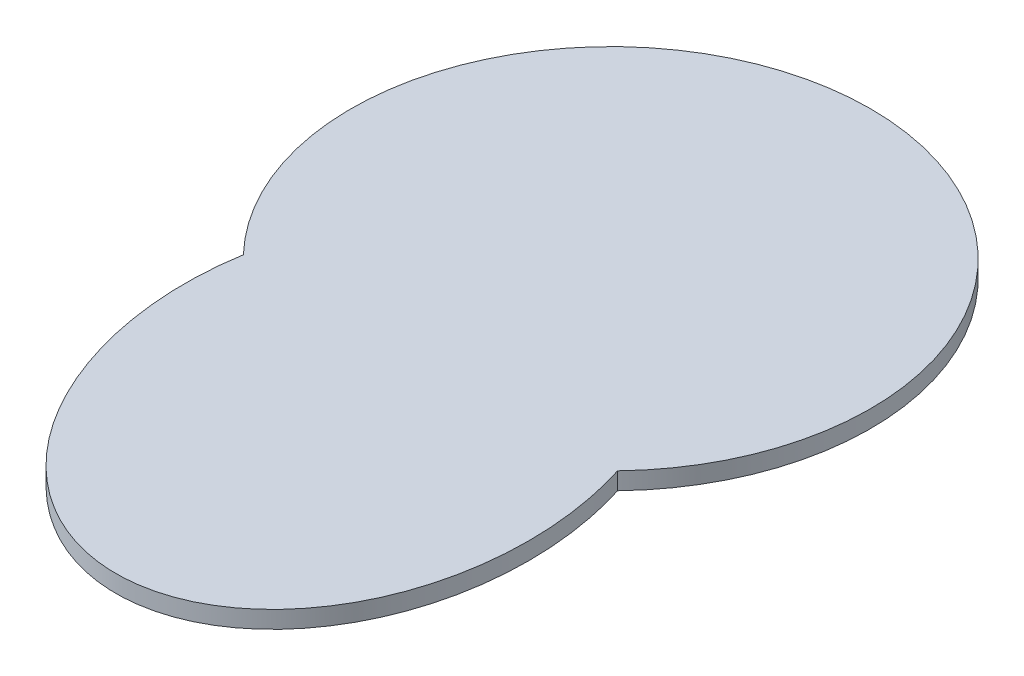
ISO-10303-21;
HEADER;
FILE_DESCRIPTION(('STEP AP214'),'2;1');
FILE_NAME('part.step','',(''),(''),'','','');
FILE_SCHEMA(('AUTOMOTIVE_DESIGN { 1 0 10303 214 1 1 1 1 }'));
ENDSEC;
DATA;
#1=APPLICATION_CONTEXT('core data for automotive mechanical design processes');
#2=APPLICATION_PROTOCOL_DEFINITION('international standard','automotive_design',2000,#1);
#3=PRODUCT_CONTEXT('',#1,'mechanical');
#4=PRODUCT('Part','Part','',(#3));
#5=PRODUCT_RELATED_PRODUCT_CATEGORY('part','',(#4));
#6=PRODUCT_DEFINITION_FORMATION('','',#4);
#7=PRODUCT_DEFINITION_CONTEXT('part definition',#1,'design');
#8=PRODUCT_DEFINITION('design','',#6,#7);
#9=PRODUCT_DEFINITION_SHAPE('','',#8);
#10=(LENGTH_UNIT() NAMED_UNIT(*) SI_UNIT(.MILLI.,.METRE.));
#11=(NAMED_UNIT(*) PLANE_ANGLE_UNIT() SI_UNIT($,.RADIAN.));
#12=(NAMED_UNIT(*) SI_UNIT($,.STERADIAN.) SOLID_ANGLE_UNIT());
#13=UNCERTAINTY_MEASURE_WITH_UNIT(LENGTH_MEASURE(1.E-05),#10,'distance_accuracy_value','');
#14=(GEOMETRIC_REPRESENTATION_CONTEXT(3) GLOBAL_UNCERTAINTY_ASSIGNED_CONTEXT((#13)) GLOBAL_UNIT_ASSIGNED_CONTEXT((#10,
#11,#12)) REPRESENTATION_CONTEXT('',''));
#15=CARTESIAN_POINT('',(0.,0.,0.));
#16=DIRECTION('',(0.,0.,1.));
#17=DIRECTION('',(1.,0.,0.));
#18=AXIS2_PLACEMENT_3D('',#15,#16,#17);
#19=CARTESIAN_POINT('',(0.,-4.,0.));
#20=DIRECTION('',(0.,1.,0.));
#21=DIRECTION('',(0.167434836238383,0.,0.985883145009502));
#22=AXIS2_PLACEMENT_3D('',#19,#20,#21);
#23=ELLIPSE('',#22,60.6317510997595,45.1879028787118);
#24=DIRECTION('',(0.,1.,0.));
#25=VECTOR('',#24,1.);
#26=SURFACE_OF_LINEAR_EXTRUSION('',#23,#25);
#27=CARTESIAN_POINT('',(0.,0.,0.));
#28=DIRECTION('',(0.,1.,0.));
#29=DIRECTION('',(0.167434836238383,0.,0.985883145009502));
#30=AXIS2_PLACEMENT_3D('',#27,#28,#29);
#31=ELLIPSE('',#30,60.6317510997595,45.1879028787118);
#32=CARTESIAN_POINT('',(-44.6681479157759,0.,-18.3945961541184));
#33=VERTEX_POINT('',#32);
#34=CARTESIAN_POINT('',(41.9343924626679,0.,-18.3945961541183));
#35=VERTEX_POINT('',#34);
#36=EDGE_CURVE('E63',#33,#35,#31,.T.);
#37=ORIENTED_EDGE('',*,*,#36,.F.);
#38=DIRECTION('',(0.,1.,0.));
#39=VECTOR('',#38,1.);
#40=CARTESIAN_POINT('',(-44.6681479157759,-4.,-18.3945961541184));
#41=LINE('',#40,#39);
#42=CARTESIAN_POINT('',(-44.6681479157759,-4.,-18.3945961541184));
#43=VERTEX_POINT('',#42);
#44=EDGE_CURVE('E11',#43,#33,#41,.T.);
#45=ORIENTED_EDGE('',*,*,#44,.F.);
#46=CARTESIAN_POINT('',(41.9343924626679,-4.,-18.3945961541183));
#47=VERTEX_POINT('',#46);
#48=EDGE_CURVE('E67',#43,#47,#23,.T.);
#49=ORIENTED_EDGE('',*,*,#48,.T.);
#50=DIRECTION('',(0.,1.,0.));
#51=VECTOR('',#50,1.);
#52=CARTESIAN_POINT('',(41.9343924626679,-4.,-18.3945961541183));
#53=LINE('',#52,#51);
#54=EDGE_CURVE('E37',#47,#35,#53,.T.);
#55=ORIENTED_EDGE('',*,*,#54,.T.);
#56=EDGE_LOOP('',(#37,#45,#49,#55));
#57=FACE_BOUND('',#56,.T.);
#58=ADVANCED_FACE('F33',(#57),#26,.T.);
#59=CARTESIAN_POINT('',(-1.36687772655399,-4.,-60.1125676917519));
#60=DIRECTION('',(0.,1.,0.));
#61=DIRECTION('',(0.,0.,1.));
#62=AXIS2_PLACEMENT_3D('',#59,#60,#61);
#63=CYLINDRICAL_SURFACE('',#62,60.1281061502423);
#64=CARTESIAN_POINT('',(-1.36687772655399,0.,-60.1125676917519));
#65=DIRECTION('',(0.,1.,0.));
#66=DIRECTION('',(0.,0.,1.));
#67=AXIS2_PLACEMENT_3D('',#64,#65,#66);
#68=CIRCLE('',#67,60.1281061502423);
#69=EDGE_CURVE('E60',#35,#33,#68,.T.);
#70=ORIENTED_EDGE('',*,*,#69,.F.);
#71=ORIENTED_EDGE('',*,*,#54,.F.);
#72=CARTESIAN_POINT('',(-1.36687772655399,-4.,-60.1125676917519));
#73=DIRECTION('',(0.,1.,0.));
#74=DIRECTION('',(0.,0.,1.));
#75=AXIS2_PLACEMENT_3D('',#72,#73,#74);
#76=CIRCLE('',#75,60.1281061502423);
#77=EDGE_CURVE('E62',#47,#43,#76,.T.);
#78=ORIENTED_EDGE('',*,*,#77,.T.);
#79=ORIENTED_EDGE('',*,*,#44,.T.);
#80=EDGE_LOOP('',(#70,#71,#78,#79));
#81=FACE_BOUND('',#80,.T.);
#82=ADVANCED_FACE('F58',(#81),#63,.T.);
#83=CARTESIAN_POINT('',(0.,-4.,0.));
#84=DIRECTION('',(0.,1.,0.));
#85=DIRECTION('',(0.,0.,1.));
#86=AXIS2_PLACEMENT_3D('',#83,#84,#85);
#87=PLANE('',#86);
#88=ORIENTED_EDGE('',*,*,#48,.F.);
#89=ORIENTED_EDGE('',*,*,#77,.F.);
#90=EDGE_LOOP('',(#88,#89));
#91=FACE_BOUND('',#90,.T.);
#92=ADVANCED_FACE('F72',(#91),#87,.F.);
#93=CARTESIAN_POINT('',(0.,0.,0.));
#94=DIRECTION('',(0.,1.,0.));
#95=DIRECTION('',(0.,0.,1.));
#96=AXIS2_PLACEMENT_3D('',#93,#94,#95);
#97=PLANE('',#96);
#98=ORIENTED_EDGE('',*,*,#36,.T.);
#99=ORIENTED_EDGE('',*,*,#69,.T.);
#100=EDGE_LOOP('',(#98,#99));
#101=FACE_BOUND('',#100,.T.);
#102=ADVANCED_FACE('F66',(#101),#97,.T.);
#103=CLOSED_SHELL('',(#58,#82,#92,#102));
#104=MANIFOLD_SOLID_BREP('B2',#103);
#105=ADVANCED_BREP_SHAPE_REPRESENTATION('',(#18,#104),#14);
#106=SHAPE_DEFINITION_REPRESENTATION(#9,#105);
ENDSEC;
END-ISO-10303-21;
